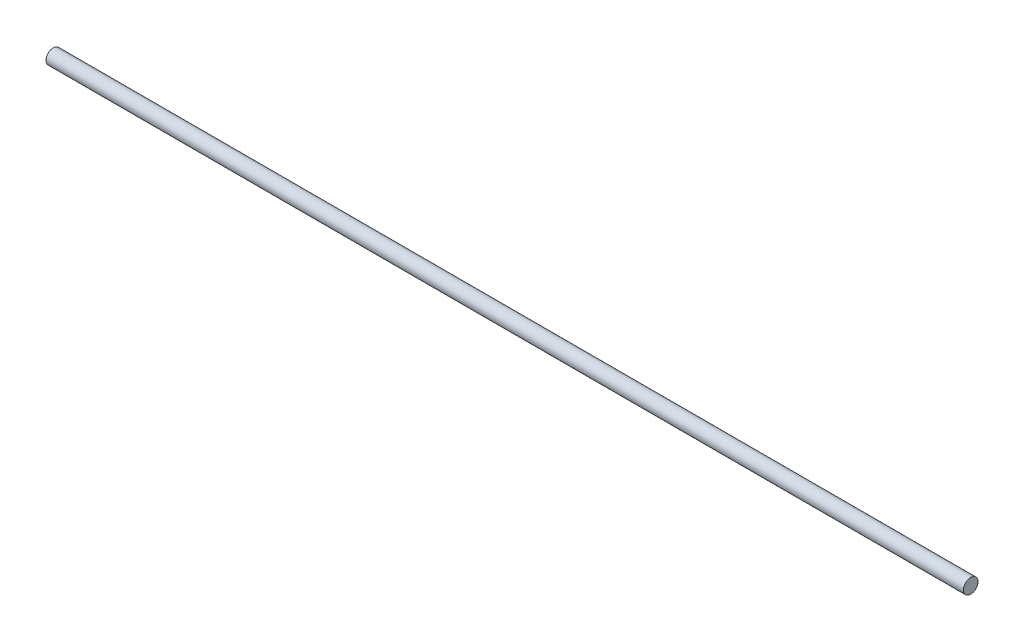
ISO-10303-21;
HEADER;
FILE_DESCRIPTION(('STEP AP214'),'2;1');
FILE_NAME('part.step','',(''),(''),'','','');
FILE_SCHEMA(('AUTOMOTIVE_DESIGN { 1 0 10303 214 1 1 1 1 }'));
ENDSEC;
DATA;
#1=APPLICATION_CONTEXT('core data for automotive mechanical design processes');
#2=APPLICATION_PROTOCOL_DEFINITION('international standard','automotive_design',2000,#1);
#3=PRODUCT_CONTEXT('',#1,'mechanical');
#4=PRODUCT('Part','Part','',(#3));
#5=PRODUCT_RELATED_PRODUCT_CATEGORY('part','',(#4));
#6=PRODUCT_DEFINITION_FORMATION('','',#4);
#7=PRODUCT_DEFINITION_CONTEXT('part definition',#1,'design');
#8=PRODUCT_DEFINITION('design','',#6,#7);
#9=PRODUCT_DEFINITION_SHAPE('','',#8);
#10=(LENGTH_UNIT() NAMED_UNIT(*) SI_UNIT(.MILLI.,.METRE.));
#11=(NAMED_UNIT(*) PLANE_ANGLE_UNIT() SI_UNIT($,.RADIAN.));
#12=(NAMED_UNIT(*) SI_UNIT($,.STERADIAN.) SOLID_ANGLE_UNIT());
#13=UNCERTAINTY_MEASURE_WITH_UNIT(LENGTH_MEASURE(1.E-05),#10,'distance_accuracy_value','');
#14=(GEOMETRIC_REPRESENTATION_CONTEXT(3) GLOBAL_UNCERTAINTY_ASSIGNED_CONTEXT((#13)) GLOBAL_UNIT_ASSIGNED_CONTEXT((#10,
#11,#12)) REPRESENTATION_CONTEXT('',''));
#15=CARTESIAN_POINT('',(0.,0.,0.));
#16=DIRECTION('',(0.,0.,1.));
#17=DIRECTION('',(1.,0.,0.));
#18=AXIS2_PLACEMENT_3D('',#15,#16,#17);
#19=CARTESIAN_POINT('',(1260.,0.,0.));
#20=DIRECTION('',(-1.,0.,0.));
#21=DIRECTION('',(0.,0.,1.));
#22=AXIS2_PLACEMENT_3D('',#19,#20,#21);
#23=CYLINDRICAL_SURFACE('',#22,10.);
#24=CARTESIAN_POINT('',(1260.,0.,0.));
#25=DIRECTION('',(1.,0.,0.));
#26=DIRECTION('',(0.,0.,-1.));
#27=AXIS2_PLACEMENT_3D('',#24,#25,#26);
#28=CIRCLE('',#27,10.);
#29=CARTESIAN_POINT('',(1260.,0.,-10.));
#30=VERTEX_POINT('',#29);
#31=EDGE_CURVE('E10',#30,#30,#28,.T.);
#32=ORIENTED_EDGE('',*,*,#31,.F.);
#33=EDGE_LOOP('',(#32));
#34=FACE_BOUND('',#33,.T.);
#35=CARTESIAN_POINT('',(0.,0.,0.));
#36=DIRECTION('',(1.,0.,0.));
#37=DIRECTION('',(0.,0.,-1.));
#38=AXIS2_PLACEMENT_3D('',#35,#36,#37);
#39=CIRCLE('',#38,10.);
#40=CARTESIAN_POINT('',(0.,0.,-10.));
#41=VERTEX_POINT('',#40);
#42=EDGE_CURVE('E40',#41,#41,#39,.T.);
#43=ORIENTED_EDGE('',*,*,#42,.T.);
#44=EDGE_LOOP('',(#43));
#45=FACE_BOUND('',#44,.T.);
#46=ADVANCED_FACE('F37',(#34,#45),#23,.T.);
#47=CARTESIAN_POINT('',(1260.,0.,0.));
#48=DIRECTION('',(1.,0.,0.));
#49=DIRECTION('',(0.,0.,-1.));
#50=AXIS2_PLACEMENT_3D('',#47,#48,#49);
#51=PLANE('',#50);
#52=ORIENTED_EDGE('',*,*,#31,.T.);
#53=EDGE_LOOP('',(#52));
#54=FACE_BOUND('',#53,.T.);
#55=ADVANCED_FACE('F54',(#54),#51,.T.);
#56=CARTESIAN_POINT('',(0.,0.,0.));
#57=DIRECTION('',(1.,0.,0.));
#58=DIRECTION('',(0.,0.,-1.));
#59=AXIS2_PLACEMENT_3D('',#56,#57,#58);
#60=PLANE('',#59);
#61=ORIENTED_EDGE('',*,*,#42,.F.);
#62=EDGE_LOOP('',(#61));
#63=FACE_BOUND('',#62,.T.);
#64=ADVANCED_FACE('F52',(#63),#60,.F.);
#65=CLOSED_SHELL('',(#46,#55,#64));
#66=MANIFOLD_SOLID_BREP('B2',#65);
#67=ADVANCED_BREP_SHAPE_REPRESENTATION('',(#18,#66),#14);
#68=SHAPE_DEFINITION_REPRESENTATION(#9,#67);
ENDSEC;
END-ISO-10303-21;
